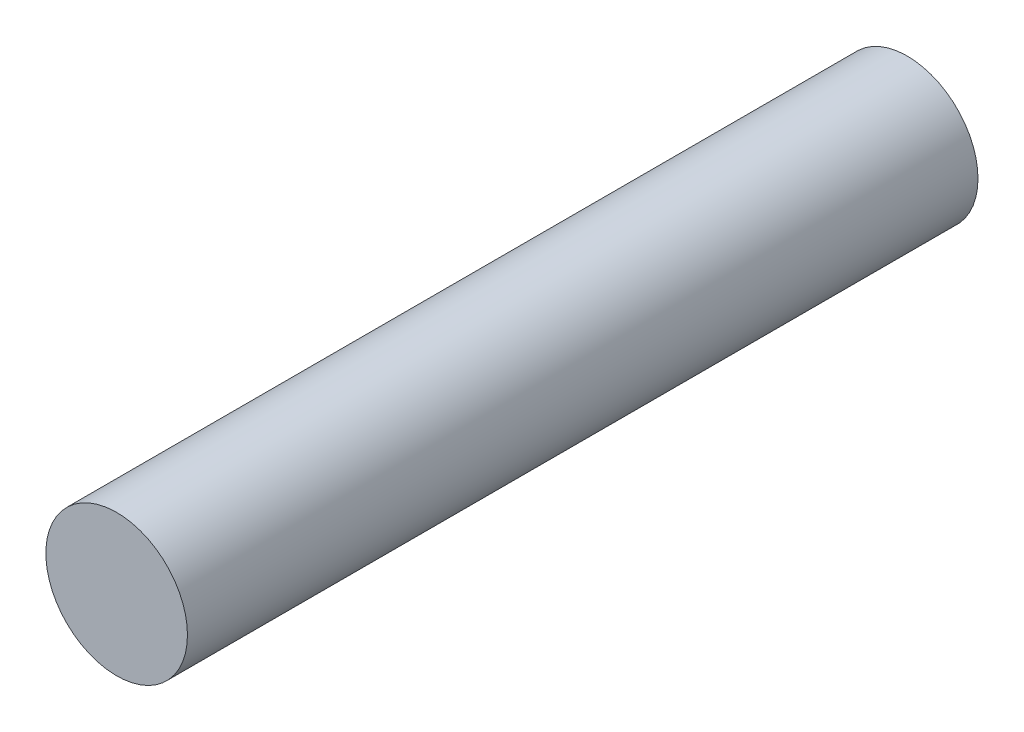
ISO-10303-21;
HEADER;
FILE_DESCRIPTION(('STEP AP214'),'2;1');
FILE_NAME('part.step','',(''),(''),'','','');
FILE_SCHEMA(('AUTOMOTIVE_DESIGN { 1 0 10303 214 1 1 1 1 }'));
ENDSEC;
DATA;
#1=APPLICATION_CONTEXT('core data for automotive mechanical design processes');
#2=APPLICATION_PROTOCOL_DEFINITION('international standard','automotive_design',2000,#1);
#3=PRODUCT_CONTEXT('',#1,'mechanical');
#4=PRODUCT('Part','Part','',(#3));
#5=PRODUCT_RELATED_PRODUCT_CATEGORY('part','',(#4));
#6=PRODUCT_DEFINITION_FORMATION('','',#4);
#7=PRODUCT_DEFINITION_CONTEXT('part definition',#1,'design');
#8=PRODUCT_DEFINITION('design','',#6,#7);
#9=PRODUCT_DEFINITION_SHAPE('','',#8);
#10=(LENGTH_UNIT() NAMED_UNIT(*) SI_UNIT(.MILLI.,.METRE.));
#11=(NAMED_UNIT(*) PLANE_ANGLE_UNIT() SI_UNIT($,.RADIAN.));
#12=(NAMED_UNIT(*) SI_UNIT($,.STERADIAN.) SOLID_ANGLE_UNIT());
#13=UNCERTAINTY_MEASURE_WITH_UNIT(LENGTH_MEASURE(1.E-05),#10,'distance_accuracy_value','');
#14=(GEOMETRIC_REPRESENTATION_CONTEXT(3) GLOBAL_UNCERTAINTY_ASSIGNED_CONTEXT((#13)) GLOBAL_UNIT_ASSIGNED_CONTEXT((#10,
#11,#12)) REPRESENTATION_CONTEXT('',''));
#15=CARTESIAN_POINT('',(0.,0.,0.));
#16=DIRECTION('',(0.,0.,1.));
#17=DIRECTION('',(1.,0.,0.));
#18=AXIS2_PLACEMENT_3D('',#15,#16,#17);
#19=CARTESIAN_POINT('',(0.,0.,-16.75));
#20=DIRECTION('',(0.,0.,1.));
#21=DIRECTION('',(1.,0.,0.));
#22=AXIS2_PLACEMENT_3D('',#19,#20,#21);
#23=CYLINDRICAL_SURFACE('',#22,1.5);
#24=CARTESIAN_POINT('',(0.,0.,-16.75));
#25=DIRECTION('',(0.,0.,1.));
#26=DIRECTION('',(1.,0.,0.));
#27=AXIS2_PLACEMENT_3D('',#24,#25,#26);
#28=CIRCLE('',#27,1.5);
#29=CARTESIAN_POINT('',(1.5,0.,-16.75));
#30=VERTEX_POINT('',#29);
#31=EDGE_CURVE('E10',#30,#30,#28,.T.);
#32=ORIENTED_EDGE('',*,*,#31,.T.);
#33=EDGE_LOOP('',(#32));
#34=FACE_BOUND('',#33,.T.);
#35=CARTESIAN_POINT('',(0.,0.,0.));
#36=DIRECTION('',(0.,0.,1.));
#37=DIRECTION('',(1.,0.,0.));
#38=AXIS2_PLACEMENT_3D('',#35,#36,#37);
#39=CIRCLE('',#38,1.5);
#40=CARTESIAN_POINT('',(1.5,0.,0.));
#41=VERTEX_POINT('',#40);
#42=EDGE_CURVE('E31',#41,#41,#39,.T.);
#43=ORIENTED_EDGE('',*,*,#42,.F.);
#44=EDGE_LOOP('',(#43));
#45=FACE_BOUND('',#44,.T.);
#46=ADVANCED_FACE('F28',(#34,#45),#23,.T.);
#47=CARTESIAN_POINT('',(0.,0.,-16.75));
#48=DIRECTION('',(0.,0.,1.));
#49=DIRECTION('',(1.,0.,0.));
#50=AXIS2_PLACEMENT_3D('',#47,#48,#49);
#51=PLANE('',#50);
#52=ORIENTED_EDGE('',*,*,#31,.F.);
#53=EDGE_LOOP('',(#52));
#54=FACE_BOUND('',#53,.T.);
#55=ADVANCED_FACE('F43',(#54),#51,.F.);
#56=CARTESIAN_POINT('',(0.,0.,0.));
#57=DIRECTION('',(0.,0.,1.));
#58=DIRECTION('',(1.,0.,0.));
#59=AXIS2_PLACEMENT_3D('',#56,#57,#58);
#60=PLANE('',#59);
#61=ORIENTED_EDGE('',*,*,#42,.T.);
#62=EDGE_LOOP('',(#61));
#63=FACE_BOUND('',#62,.T.);
#64=ADVANCED_FACE('F40',(#63),#60,.T.);
#65=CLOSED_SHELL('',(#46,#55,#64));
#66=MANIFOLD_SOLID_BREP('B2',#65);
#67=ADVANCED_BREP_SHAPE_REPRESENTATION('',(#18,#66),#14);
#68=SHAPE_DEFINITION_REPRESENTATION(#9,#67);
ENDSEC;
END-ISO-10303-21;
